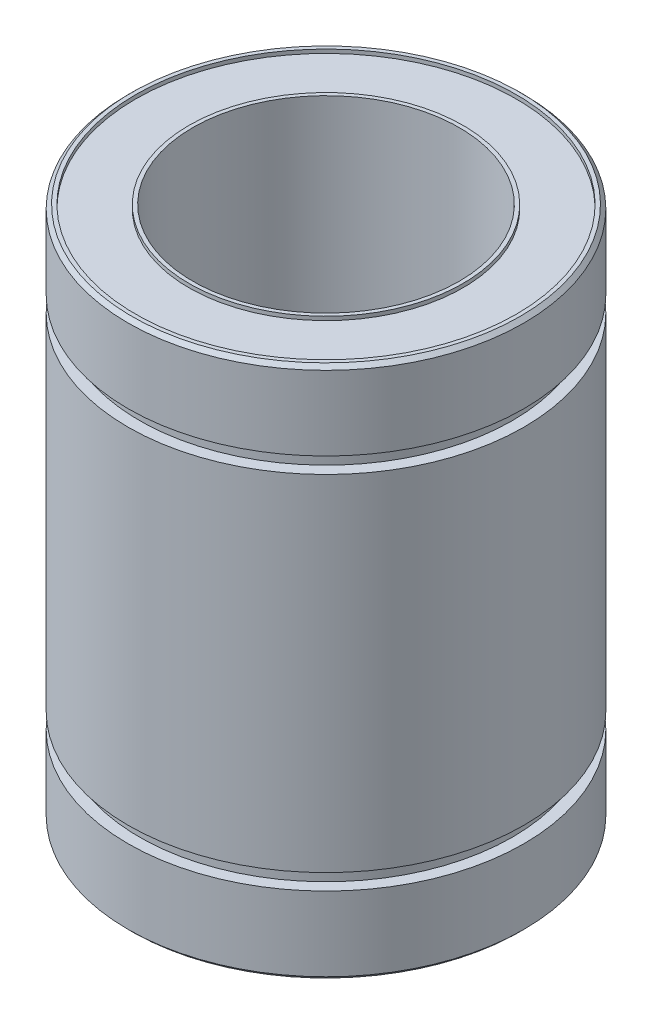
ISO-10303-21;
HEADER;
FILE_DESCRIPTION(('STEP AP214'),'2;1');
FILE_NAME('part.step','',(''),(''),'','','');
FILE_SCHEMA(('AUTOMOTIVE_DESIGN { 1 0 10303 214 1 1 1 1 }'));
ENDSEC;
DATA;
#1=APPLICATION_CONTEXT('core data for automotive mechanical design processes');
#2=APPLICATION_PROTOCOL_DEFINITION('international standard','automotive_design',2000,#1);
#3=PRODUCT_CONTEXT('',#1,'mechanical');
#4=PRODUCT('Part','Part','',(#3));
#5=PRODUCT_RELATED_PRODUCT_CATEGORY('part','',(#4));
#6=PRODUCT_DEFINITION_FORMATION('','',#4);
#7=PRODUCT_DEFINITION_CONTEXT('part definition',#1,'design');
#8=PRODUCT_DEFINITION('design','',#6,#7);
#9=PRODUCT_DEFINITION_SHAPE('','',#8);
#10=(LENGTH_UNIT() NAMED_UNIT(*) SI_UNIT(.MILLI.,.METRE.));
#11=(NAMED_UNIT(*) PLANE_ANGLE_UNIT() SI_UNIT($,.RADIAN.));
#12=(NAMED_UNIT(*) SI_UNIT($,.STERADIAN.) SOLID_ANGLE_UNIT());
#13=UNCERTAINTY_MEASURE_WITH_UNIT(LENGTH_MEASURE(1.E-05),#10,'distance_accuracy_value','');
#14=(GEOMETRIC_REPRESENTATION_CONTEXT(3) GLOBAL_UNCERTAINTY_ASSIGNED_CONTEXT((#13)) GLOBAL_UNIT_ASSIGNED_CONTEXT((#10,
#11,#12)) REPRESENTATION_CONTEXT('',''));
#15=CARTESIAN_POINT('',(0.,0.,0.));
#16=DIRECTION('',(0.,0.,1.));
#17=DIRECTION('',(1.,0.,0.));
#18=AXIS2_PLACEMENT_3D('',#15,#16,#17);
#19=CARTESIAN_POINT('',(0.,35.,0.));
#20=DIRECTION('',(0.,1.,0.));
#21=DIRECTION('',(-1.,0.,0.));
#22=AXIS2_PLACEMENT_3D('',#19,#20,#21);
#23=CYLINDRICAL_SURFACE('',#22,26.);
#24=CARTESIAN_POINT('',(0.,-22.65,0.));
#25=DIRECTION('',(0.,1.,0.));
#26=DIRECTION('',(-1.,0.,0.));
#27=AXIS2_PLACEMENT_3D('',#24,#25,#26);
#28=CIRCLE('',#27,26.);
#29=CARTESIAN_POINT('',(-26.,-22.65,0.));
#30=VERTEX_POINT('',#29);
#31=EDGE_CURVE('E79',#30,#30,#28,.T.);
#32=ORIENTED_EDGE('',*,*,#31,.T.);
#33=EDGE_LOOP('',(#32));
#34=FACE_BOUND('',#33,.T.);
#35=CARTESIAN_POINT('',(0.,22.65,0.));
#36=DIRECTION('',(0.,1.,0.));
#37=DIRECTION('',(-1.,0.,0.));
#38=AXIS2_PLACEMENT_3D('',#35,#36,#37);
#39=CIRCLE('',#38,26.);
#40=CARTESIAN_POINT('',(-26.,22.65,0.));
#41=VERTEX_POINT('',#40);
#42=EDGE_CURVE('E17',#41,#41,#39,.F.);
#43=ORIENTED_EDGE('',*,*,#42,.T.);
#44=EDGE_LOOP('',(#43));
#45=FACE_BOUND('',#44,.T.);
#46=ADVANCED_FACE('F14',(#34,#45),#23,.T.);
#47=CARTESIAN_POINT('',(24.5,22.65,0.));
#48=DIRECTION('',(0.,-1.,0.));
#49=DIRECTION('',(1.,0.,0.));
#50=AXIS2_PLACEMENT_3D('',#47,#48,#49);
#51=PLANE('',#50);
#52=CARTESIAN_POINT('',(0.,22.65,0.));
#53=DIRECTION('',(0.,1.,0.));
#54=DIRECTION('',(-1.,0.,0.));
#55=AXIS2_PLACEMENT_3D('',#52,#53,#54);
#56=CIRCLE('',#55,24.5);
#57=CARTESIAN_POINT('',(-24.5,22.65,0.));
#58=VERTEX_POINT('',#57);
#59=EDGE_CURVE('E77',#58,#58,#56,.T.);
#60=ORIENTED_EDGE('',*,*,#59,.F.);
#61=EDGE_LOOP('',(#60));
#62=FACE_BOUND('',#61,.T.);
#63=ORIENTED_EDGE('',*,*,#42,.F.);
#64=EDGE_LOOP('',(#63));
#65=FACE_BOUND('',#64,.T.);
#66=ADVANCED_FACE('F87',(#62,#65),#51,.F.);
#67=CARTESIAN_POINT('',(26.,-22.65,0.));
#68=DIRECTION('',(0.,1.,0.));
#69=DIRECTION('',(-1.,0.,0.));
#70=AXIS2_PLACEMENT_3D('',#67,#68,#69);
#71=PLANE('',#70);
#72=CARTESIAN_POINT('',(0.,-22.65,0.));
#73=DIRECTION('',(0.,1.,0.));
#74=DIRECTION('',(-1.,0.,0.));
#75=AXIS2_PLACEMENT_3D('',#72,#73,#74);
#76=CIRCLE('',#75,24.5);
#77=CARTESIAN_POINT('',(-24.5,-22.65,0.));
#78=VERTEX_POINT('',#77);
#79=EDGE_CURVE('E74',#78,#78,#76,.F.);
#80=ORIENTED_EDGE('',*,*,#79,.F.);
#81=EDGE_LOOP('',(#80));
#82=FACE_BOUND('',#81,.T.);
#83=ORIENTED_EDGE('',*,*,#31,.F.);
#84=EDGE_LOOP('',(#83));
#85=FACE_BOUND('',#84,.T.);
#86=ADVANCED_FACE('F89',(#82,#85),#71,.F.);
#87=CARTESIAN_POINT('',(0.,35.,0.));
#88=DIRECTION('',(0.,1.,0.));
#89=DIRECTION('',(-1.,0.,0.));
#90=AXIS2_PLACEMENT_3D('',#87,#88,#89);
#91=CYLINDRICAL_SURFACE('',#90,24.5);
#92=ORIENTED_EDGE('',*,*,#59,.T.);
#93=EDGE_LOOP('',(#92));
#94=FACE_BOUND('',#93,.T.);
#95=CARTESIAN_POINT('',(0.,24.75,0.));
#96=DIRECTION('',(0.,1.,0.));
#97=DIRECTION('',(-1.,0.,0.));
#98=AXIS2_PLACEMENT_3D('',#95,#96,#97);
#99=CIRCLE('',#98,24.5);
#100=CARTESIAN_POINT('',(-24.5,24.75,0.));
#101=VERTEX_POINT('',#100);
#102=EDGE_CURVE('E71',#101,#101,#99,.F.);
#103=ORIENTED_EDGE('',*,*,#102,.T.);
#104=EDGE_LOOP('',(#103));
#105=FACE_BOUND('',#104,.T.);
#106=ADVANCED_FACE('F96',(#94,#105),#91,.T.);
#107=CARTESIAN_POINT('',(0.,35.,0.));
#108=DIRECTION('',(0.,1.,0.));
#109=DIRECTION('',(-1.,0.,0.));
#110=AXIS2_PLACEMENT_3D('',#107,#108,#109);
#111=CYLINDRICAL_SURFACE('',#110,24.5);
#112=CARTESIAN_POINT('',(0.,-24.75,0.));
#113=DIRECTION('',(0.,1.,0.));
#114=DIRECTION('',(-1.,0.,0.));
#115=AXIS2_PLACEMENT_3D('',#112,#113,#114);
#116=CIRCLE('',#115,24.5);
#117=CARTESIAN_POINT('',(-24.5,-24.75,0.));
#118=VERTEX_POINT('',#117);
#119=EDGE_CURVE('E68',#118,#118,#116,.T.);
#120=ORIENTED_EDGE('',*,*,#119,.T.);
#121=EDGE_LOOP('',(#120));
#122=FACE_BOUND('',#121,.T.);
#123=ORIENTED_EDGE('',*,*,#79,.T.);
#124=EDGE_LOOP('',(#123));
#125=FACE_BOUND('',#124,.T.);
#126=ADVANCED_FACE('F171',(#122,#125),#111,.T.);
#127=CARTESIAN_POINT('',(26.,24.75,0.));
#128=DIRECTION('',(0.,1.,0.));
#129=DIRECTION('',(-1.,0.,0.));
#130=AXIS2_PLACEMENT_3D('',#127,#128,#129);
#131=PLANE('',#130);
#132=ORIENTED_EDGE('',*,*,#102,.F.);
#133=EDGE_LOOP('',(#132));
#134=FACE_BOUND('',#133,.T.);
#135=CARTESIAN_POINT('',(0.,24.75,0.));
#136=DIRECTION('',(0.,1.,0.));
#137=DIRECTION('',(-1.,0.,0.));
#138=AXIS2_PLACEMENT_3D('',#135,#136,#137);
#139=CIRCLE('',#138,26.);
#140=CARTESIAN_POINT('',(-26.,24.75,0.));
#141=VERTEX_POINT('',#140);
#142=EDGE_CURVE('E65',#141,#141,#139,.T.);
#143=ORIENTED_EDGE('',*,*,#142,.F.);
#144=EDGE_LOOP('',(#143));
#145=FACE_BOUND('',#144,.T.);
#146=ADVANCED_FACE('F167',(#134,#145),#131,.F.);
#147=CARTESIAN_POINT('',(24.5,-24.75,0.));
#148=DIRECTION('',(0.,-1.,0.));
#149=DIRECTION('',(1.,0.,0.));
#150=AXIS2_PLACEMENT_3D('',#147,#148,#149);
#151=PLANE('',#150);
#152=ORIENTED_EDGE('',*,*,#119,.F.);
#153=EDGE_LOOP('',(#152));
#154=FACE_BOUND('',#153,.T.);
#155=CARTESIAN_POINT('',(0.,-24.75,0.));
#156=DIRECTION('',(0.,1.,0.));
#157=DIRECTION('',(-1.,0.,0.));
#158=AXIS2_PLACEMENT_3D('',#155,#156,#157);
#159=CIRCLE('',#158,26.);
#160=CARTESIAN_POINT('',(-26.,-24.75,0.));
#161=VERTEX_POINT('',#160);
#162=EDGE_CURVE('E62',#161,#161,#159,.F.);
#163=ORIENTED_EDGE('',*,*,#162,.F.);
#164=EDGE_LOOP('',(#163));
#165=FACE_BOUND('',#164,.T.);
#166=ADVANCED_FACE('F163',(#154,#165),#151,.F.);
#167=CARTESIAN_POINT('',(0.,35.,0.));
#168=DIRECTION('',(0.,1.,0.));
#169=DIRECTION('',(-1.,0.,0.));
#170=AXIS2_PLACEMENT_3D('',#167,#168,#169);
#171=CYLINDRICAL_SURFACE('',#170,26.);
#172=ORIENTED_EDGE('',*,*,#142,.T.);
#173=EDGE_LOOP('',(#172));
#174=FACE_BOUND('',#173,.T.);
#175=CARTESIAN_POINT('',(0.,34.5,0.));
#176=DIRECTION('',(0.,-1.,0.));
#177=DIRECTION('',(1.,0.,0.));
#178=AXIS2_PLACEMENT_3D('',#175,#176,#177);
#179=CIRCLE('',#178,26.);
#180=CARTESIAN_POINT('',(26.,34.5,0.));
#181=VERTEX_POINT('',#180);
#182=EDGE_CURVE('E29',#181,#181,#179,.F.);
#183=ORIENTED_EDGE('',*,*,#182,.F.);
#184=EDGE_LOOP('',(#183));
#185=FACE_BOUND('',#184,.T.);
#186=ADVANCED_FACE('F159',(#174,#185),#171,.T.);
#187=CARTESIAN_POINT('',(0.,35.,0.));
#188=DIRECTION('',(0.,1.,0.));
#189=DIRECTION('',(-1.,0.,0.));
#190=AXIS2_PLACEMENT_3D('',#187,#188,#189);
#191=CYLINDRICAL_SURFACE('',#190,26.);
#192=CARTESIAN_POINT('',(0.,-34.5,0.));
#193=DIRECTION('',(0.,1.,0.));
#194=DIRECTION('',(-1.,0.,0.));
#195=AXIS2_PLACEMENT_3D('',#192,#193,#194);
#196=CIRCLE('',#195,26.);
#197=CARTESIAN_POINT('',(-26.,-34.5,0.));
#198=VERTEX_POINT('',#197);
#199=EDGE_CURVE('E61',#198,#198,#196,.F.);
#200=ORIENTED_EDGE('',*,*,#199,.F.);
#201=EDGE_LOOP('',(#200));
#202=FACE_BOUND('',#201,.T.);
#203=ORIENTED_EDGE('',*,*,#162,.T.);
#204=EDGE_LOOP('',(#203));
#205=FACE_BOUND('',#204,.T.);
#206=ADVANCED_FACE('F155',(#202,#205),#191,.T.);
#207=CARTESIAN_POINT('',(0.,34.5,0.));
#208=DIRECTION('',(0.,-1.,0.));
#209=DIRECTION('',(1.,0.,0.));
#210=AXIS2_PLACEMENT_3D('',#207,#208,#209);
#211=CONICAL_SURFACE('',#210,26.,0.785398163397445);
#212=CARTESIAN_POINT('',(0.,35.,0.));
#213=DIRECTION('',(0.,-1.,0.));
#214=DIRECTION('',(1.,0.,0.));
#215=AXIS2_PLACEMENT_3D('',#212,#213,#214);
#216=CIRCLE('',#215,25.5);
#217=CARTESIAN_POINT('',(25.5,35.,0.));
#218=VERTEX_POINT('',#217);
#219=EDGE_CURVE('E58',#218,#218,#216,.T.);
#220=ORIENTED_EDGE('',*,*,#219,.T.);
#221=EDGE_LOOP('',(#220));
#222=FACE_BOUND('',#221,.T.);
#223=ORIENTED_EDGE('',*,*,#182,.T.);
#224=EDGE_LOOP('',(#223));
#225=FACE_BOUND('',#224,.T.);
#226=ADVANCED_FACE('F151',(#222,#225),#211,.T.);
#227=CARTESIAN_POINT('',(0.,-34.5,0.));
#228=DIRECTION('',(0.,1.,0.));
#229=DIRECTION('',(-1.,0.,0.));
#230=AXIS2_PLACEMENT_3D('',#227,#228,#229);
#231=CONICAL_SURFACE('',#230,26.,0.785398163397442);
#232=CARTESIAN_POINT('',(0.,-35.,0.));
#233=DIRECTION('',(0.,1.,0.));
#234=DIRECTION('',(-1.,0.,0.));
#235=AXIS2_PLACEMENT_3D('',#232,#233,#234);
#236=CIRCLE('',#235,25.5);
#237=CARTESIAN_POINT('',(-25.5,-35.,0.));
#238=VERTEX_POINT('',#237);
#239=EDGE_CURVE('E55',#238,#238,#236,.T.);
#240=ORIENTED_EDGE('',*,*,#239,.T.);
#241=EDGE_LOOP('',(#240));
#242=FACE_BOUND('',#241,.T.);
#243=ORIENTED_EDGE('',*,*,#199,.T.);
#244=EDGE_LOOP('',(#243));
#245=FACE_BOUND('',#244,.T.);
#246=ADVANCED_FACE('F147',(#242,#245),#231,.T.);
#247=CARTESIAN_POINT('',(17.5,35.,0.));
#248=DIRECTION('',(0.,-1.,0.));
#249=DIRECTION('',(1.,0.,0.));
#250=AXIS2_PLACEMENT_3D('',#247,#248,#249);
#251=PLANE('',#250);
#252=CARTESIAN_POINT('',(0.,35.,0.));
#253=DIRECTION('',(0.,1.,0.));
#254=DIRECTION('',(-1.,0.,0.));
#255=AXIS2_PLACEMENT_3D('',#252,#253,#254);
#256=CIRCLE('',#255,25.);
#257=CARTESIAN_POINT('',(-25.,35.,0.));
#258=VERTEX_POINT('',#257);
#259=EDGE_CURVE('E52',#258,#258,#256,.F.);
#260=ORIENTED_EDGE('',*,*,#259,.T.);
#261=EDGE_LOOP('',(#260));
#262=FACE_BOUND('',#261,.T.);
#263=ORIENTED_EDGE('',*,*,#219,.F.);
#264=EDGE_LOOP('',(#263));
#265=FACE_BOUND('',#264,.T.);
#266=ADVANCED_FACE('F143',(#262,#265),#251,.F.);
#267=CARTESIAN_POINT('',(25.5,-35.,0.));
#268=DIRECTION('',(0.,1.,0.));
#269=DIRECTION('',(-1.,0.,0.));
#270=AXIS2_PLACEMENT_3D('',#267,#268,#269);
#271=PLANE('',#270);
#272=CARTESIAN_POINT('',(0.,-35.,0.));
#273=DIRECTION('',(0.,-1.,0.));
#274=DIRECTION('',(1.,0.,0.));
#275=AXIS2_PLACEMENT_3D('',#272,#273,#274);
#276=CIRCLE('',#275,25.);
#277=CARTESIAN_POINT('',(25.,-35.,0.));
#278=VERTEX_POINT('',#277);
#279=EDGE_CURVE('E49',#278,#278,#276,.F.);
#280=ORIENTED_EDGE('',*,*,#279,.T.);
#281=EDGE_LOOP('',(#280));
#282=FACE_BOUND('',#281,.T.);
#283=ORIENTED_EDGE('',*,*,#239,.F.);
#284=EDGE_LOOP('',(#283));
#285=FACE_BOUND('',#284,.T.);
#286=ADVANCED_FACE('F139',(#282,#285),#271,.F.);
#287=CARTESIAN_POINT('',(0.,34.5,0.));
#288=DIRECTION('',(0.,1.,0.));
#289=DIRECTION('',(-1.,0.,0.));
#290=AXIS2_PLACEMENT_3D('',#287,#288,#289);
#291=CYLINDRICAL_SURFACE('',#290,25.);
#292=ORIENTED_EDGE('',*,*,#259,.F.);
#293=EDGE_LOOP('',(#292));
#294=FACE_BOUND('',#293,.T.);
#295=CARTESIAN_POINT('',(0.,34.5,0.));
#296=DIRECTION('',(0.,1.,0.));
#297=DIRECTION('',(-1.,0.,0.));
#298=AXIS2_PLACEMENT_3D('',#295,#296,#297);
#299=CIRCLE('',#298,25.);
#300=CARTESIAN_POINT('',(-25.,34.5,0.));
#301=VERTEX_POINT('',#300);
#302=EDGE_CURVE('E46',#301,#301,#299,.T.);
#303=ORIENTED_EDGE('',*,*,#302,.F.);
#304=EDGE_LOOP('',(#303));
#305=FACE_BOUND('',#304,.T.);
#306=ADVANCED_FACE('F135',(#294,#305),#291,.F.);
#307=CARTESIAN_POINT('',(0.,-34.5,0.));
#308=DIRECTION('',(0.,-1.,0.));
#309=DIRECTION('',(1.,0.,0.));
#310=AXIS2_PLACEMENT_3D('',#307,#308,#309);
#311=CYLINDRICAL_SURFACE('',#310,25.);
#312=ORIENTED_EDGE('',*,*,#279,.F.);
#313=EDGE_LOOP('',(#312));
#314=FACE_BOUND('',#313,.T.);
#315=CARTESIAN_POINT('',(0.,-34.5,0.));
#316=DIRECTION('',(0.,-1.,0.));
#317=DIRECTION('',(1.,0.,0.));
#318=AXIS2_PLACEMENT_3D('',#315,#316,#317);
#319=CIRCLE('',#318,25.);
#320=CARTESIAN_POINT('',(25.,-34.5,0.));
#321=VERTEX_POINT('',#320);
#322=EDGE_CURVE('E43',#321,#321,#319,.T.);
#323=ORIENTED_EDGE('',*,*,#322,.F.);
#324=EDGE_LOOP('',(#323));
#325=FACE_BOUND('',#324,.T.);
#326=ADVANCED_FACE('F131',(#314,#325),#311,.F.);
#327=CARTESIAN_POINT('',(0.,34.5,0.));
#328=DIRECTION('',(0.,1.,0.));
#329=DIRECTION('',(-1.,0.,0.));
#330=AXIS2_PLACEMENT_3D('',#327,#328,#329);
#331=PLANE('',#330);
#332=CARTESIAN_POINT('',(0.,34.5,0.));
#333=DIRECTION('',(0.,1.,0.));
#334=DIRECTION('',(-1.,0.,0.));
#335=AXIS2_PLACEMENT_3D('',#332,#333,#334);
#336=CIRCLE('',#335,18.);
#337=CARTESIAN_POINT('',(-18.,34.5,0.));
#338=VERTEX_POINT('',#337);
#339=EDGE_CURVE('E40',#338,#338,#336,.T.);
#340=ORIENTED_EDGE('',*,*,#339,.F.);
#341=EDGE_LOOP('',(#340));
#342=FACE_BOUND('',#341,.T.);
#343=ORIENTED_EDGE('',*,*,#302,.T.);
#344=EDGE_LOOP('',(#343));
#345=FACE_BOUND('',#344,.T.);
#346=ADVANCED_FACE('F127',(#342,#345),#331,.T.);
#347=CARTESIAN_POINT('',(0.,-34.5,0.));
#348=DIRECTION('',(0.,-1.,0.));
#349=DIRECTION('',(1.,0.,0.));
#350=AXIS2_PLACEMENT_3D('',#347,#348,#349);
#351=PLANE('',#350);
#352=CARTESIAN_POINT('',(0.,-34.5,0.));
#353=DIRECTION('',(0.,-1.,0.));
#354=DIRECTION('',(1.,0.,0.));
#355=AXIS2_PLACEMENT_3D('',#352,#353,#354);
#356=CIRCLE('',#355,18.);
#357=CARTESIAN_POINT('',(18.,-34.5,0.));
#358=VERTEX_POINT('',#357);
#359=EDGE_CURVE('E37',#358,#358,#356,.T.);
#360=ORIENTED_EDGE('',*,*,#359,.F.);
#361=EDGE_LOOP('',(#360));
#362=FACE_BOUND('',#361,.T.);
#363=ORIENTED_EDGE('',*,*,#322,.T.);
#364=EDGE_LOOP('',(#363));
#365=FACE_BOUND('',#364,.T.);
#366=ADVANCED_FACE('F123',(#362,#365),#351,.T.);
#367=CARTESIAN_POINT('',(0.,34.5,0.));
#368=DIRECTION('',(0.,1.,0.));
#369=DIRECTION('',(-1.,0.,0.));
#370=AXIS2_PLACEMENT_3D('',#367,#368,#369);
#371=CYLINDRICAL_SURFACE('',#370,18.);
#372=ORIENTED_EDGE('',*,*,#339,.T.);
#373=EDGE_LOOP('',(#372));
#374=FACE_BOUND('',#373,.T.);
#375=CARTESIAN_POINT('',(0.,35.,0.));
#376=DIRECTION('',(0.,1.,0.));
#377=DIRECTION('',(-1.,0.,0.));
#378=AXIS2_PLACEMENT_3D('',#375,#376,#377);
#379=CIRCLE('',#378,18.);
#380=CARTESIAN_POINT('',(-18.,35.,0.));
#381=VERTEX_POINT('',#380);
#382=EDGE_CURVE('E34',#381,#381,#379,.F.);
#383=ORIENTED_EDGE('',*,*,#382,.T.);
#384=EDGE_LOOP('',(#383));
#385=FACE_BOUND('',#384,.T.);
#386=ADVANCED_FACE('F119',(#374,#385),#371,.T.);
#387=CARTESIAN_POINT('',(0.,-34.5,0.));
#388=DIRECTION('',(0.,-1.,0.));
#389=DIRECTION('',(1.,0.,0.));
#390=AXIS2_PLACEMENT_3D('',#387,#388,#389);
#391=CYLINDRICAL_SURFACE('',#390,18.);
#392=ORIENTED_EDGE('',*,*,#359,.T.);
#393=EDGE_LOOP('',(#392));
#394=FACE_BOUND('',#393,.T.);
#395=CARTESIAN_POINT('',(0.,-35.,0.));
#396=DIRECTION('',(0.,-1.,0.));
#397=DIRECTION('',(1.,0.,0.));
#398=AXIS2_PLACEMENT_3D('',#395,#396,#397);
#399=CIRCLE('',#398,18.);
#400=CARTESIAN_POINT('',(18.,-35.,0.));
#401=VERTEX_POINT('',#400);
#402=EDGE_CURVE('E26',#401,#401,#399,.F.);
#403=ORIENTED_EDGE('',*,*,#402,.T.);
#404=EDGE_LOOP('',(#403));
#405=FACE_BOUND('',#404,.T.);
#406=ADVANCED_FACE('F115',(#394,#405),#391,.T.);
#407=CARTESIAN_POINT('',(17.5,35.,0.));
#408=DIRECTION('',(0.,-1.,0.));
#409=DIRECTION('',(1.,0.,0.));
#410=AXIS2_PLACEMENT_3D('',#407,#408,#409);
#411=PLANE('',#410);
#412=CARTESIAN_POINT('',(0.,35.,0.));
#413=DIRECTION('',(0.,1.,0.));
#414=DIRECTION('',(-1.,0.,0.));
#415=AXIS2_PLACEMENT_3D('',#412,#413,#414);
#416=CIRCLE('',#415,17.5);
#417=CARTESIAN_POINT('',(-17.5,35.,0.));
#418=VERTEX_POINT('',#417);
#419=EDGE_CURVE('E21',#418,#418,#416,.F.);
#420=ORIENTED_EDGE('',*,*,#419,.T.);
#421=EDGE_LOOP('',(#420));
#422=FACE_BOUND('',#421,.T.);
#423=ORIENTED_EDGE('',*,*,#382,.F.);
#424=EDGE_LOOP('',(#423));
#425=FACE_BOUND('',#424,.T.);
#426=ADVANCED_FACE('F108',(#422,#425),#411,.F.);
#427=CARTESIAN_POINT('',(25.5,-35.,0.));
#428=DIRECTION('',(0.,1.,0.));
#429=DIRECTION('',(-1.,0.,0.));
#430=AXIS2_PLACEMENT_3D('',#427,#428,#429);
#431=PLANE('',#430);
#432=CARTESIAN_POINT('',(0.,-35.,0.));
#433=DIRECTION('',(0.,1.,0.));
#434=DIRECTION('',(-1.,0.,0.));
#435=AXIS2_PLACEMENT_3D('',#432,#433,#434);
#436=CIRCLE('',#435,17.5);
#437=CARTESIAN_POINT('',(-17.5,-35.,0.));
#438=VERTEX_POINT('',#437);
#439=EDGE_CURVE('E9',#438,#438,#436,.T.);
#440=ORIENTED_EDGE('',*,*,#439,.T.);
#441=EDGE_LOOP('',(#440));
#442=FACE_BOUND('',#441,.T.);
#443=ORIENTED_EDGE('',*,*,#402,.F.);
#444=EDGE_LOOP('',(#443));
#445=FACE_BOUND('',#444,.T.);
#446=ADVANCED_FACE('F102',(#442,#445),#431,.F.);
#447=CARTESIAN_POINT('',(0.,35.,0.));
#448=DIRECTION('',(0.,1.,0.));
#449=DIRECTION('',(-1.,0.,0.));
#450=AXIS2_PLACEMENT_3D('',#447,#448,#449);
#451=CYLINDRICAL_SURFACE('',#450,17.5);
#452=ORIENTED_EDGE('',*,*,#419,.F.);
#453=EDGE_LOOP('',(#452));
#454=FACE_BOUND('',#453,.T.);
#455=ORIENTED_EDGE('',*,*,#439,.F.);
#456=EDGE_LOOP('',(#455));
#457=FACE_BOUND('',#456,.T.);
#458=ADVANCED_FACE('F100',(#454,#457),#451,.F.);
#459=CLOSED_SHELL('',(#46,#66,#86,#106,#126,#146,#166,#186,#206,#226,#246,#266,#286,#306,#326,
#346,#366,#386,#406,#426,#446,#458));
#460=MANIFOLD_SOLID_BREP('B1',#459);
#461=ADVANCED_BREP_SHAPE_REPRESENTATION('',(#18,#460),#14);
#462=SHAPE_DEFINITION_REPRESENTATION(#9,#461);
ENDSEC;
END-ISO-10303-21;
